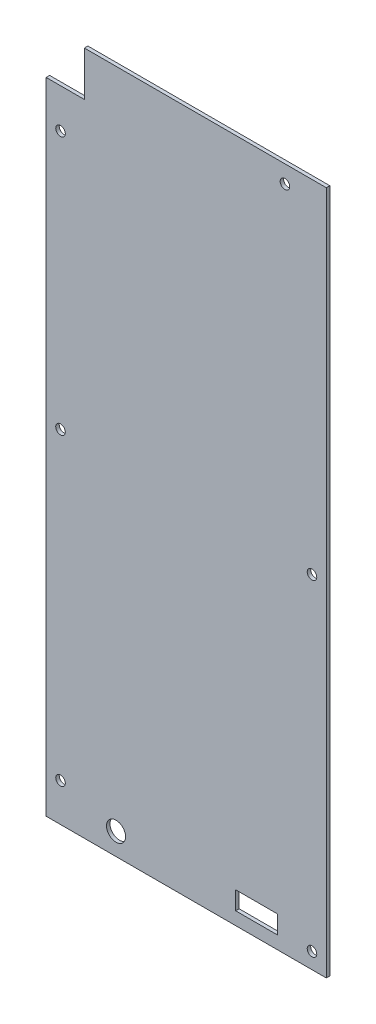
ISO-10303-21;
HEADER;
FILE_DESCRIPTION(('STEP AP214'),'2;1');
FILE_NAME('part.step','',(''),(''),'','','');
FILE_SCHEMA(('AUTOMOTIVE_DESIGN { 1 0 10303 214 1 1 1 1 }'));
ENDSEC;
DATA;
#1=APPLICATION_CONTEXT('core data for automotive mechanical design processes');
#2=APPLICATION_PROTOCOL_DEFINITION('international standard','automotive_design',2000,#1);
#3=PRODUCT_CONTEXT('',#1,'mechanical');
#4=PRODUCT('Part','Part','',(#3));
#5=PRODUCT_RELATED_PRODUCT_CATEGORY('part','',(#4));
#6=PRODUCT_DEFINITION_FORMATION('','',#4);
#7=PRODUCT_DEFINITION_CONTEXT('part definition',#1,'design');
#8=PRODUCT_DEFINITION('design','',#6,#7);
#9=PRODUCT_DEFINITION_SHAPE('','',#8);
#10=(LENGTH_UNIT() NAMED_UNIT(*) SI_UNIT(.MILLI.,.METRE.));
#11=(NAMED_UNIT(*) PLANE_ANGLE_UNIT() SI_UNIT($,.RADIAN.));
#12=(NAMED_UNIT(*) SI_UNIT($,.STERADIAN.) SOLID_ANGLE_UNIT());
#13=UNCERTAINTY_MEASURE_WITH_UNIT(LENGTH_MEASURE(1.E-05),#10,'distance_accuracy_value','');
#14=(GEOMETRIC_REPRESENTATION_CONTEXT(3) GLOBAL_UNCERTAINTY_ASSIGNED_CONTEXT((#13)) GLOBAL_UNIT_ASSIGNED_CONTEXT((#10,
#11,#12)) REPRESENTATION_CONTEXT('',''));
#15=CARTESIAN_POINT('',(0.,0.,0.));
#16=DIRECTION('',(0.,0.,1.));
#17=DIRECTION('',(1.,0.,0.));
#18=AXIS2_PLACEMENT_3D('',#15,#16,#17);
#19=CARTESIAN_POINT('',(-43.4054880311596,36.5751828079822,1.1));
#20=DIRECTION('',(1.,0.,0.));
#21=DIRECTION('',(0.,0.,-1.));
#22=AXIS2_PLACEMENT_3D('',#19,#20,#21);
#23=PLANE('',#22);
#24=DIRECTION('',(0.,-1.,0.));
#25=VECTOR('',#24,1.);
#26=CARTESIAN_POINT('',(-43.4054880311596,36.5751828079822,1.1));
#27=LINE('',#26,#25);
#28=CARTESIAN_POINT('',(-43.4054880311596,22.5761319376729,1.1));
#29=VERTEX_POINT('',#28);
#30=CARTESIAN_POINT('',(-43.4054880311596,-178.424817192018,1.1));
#31=VERTEX_POINT('',#30);
#32=EDGE_CURVE('E222',#29,#31,#27,.T.);
#33=ORIENTED_EDGE('',*,*,#32,.F.);
#34=DIRECTION('',(0.,0.,1.));
#35=VECTOR('',#34,1.);
#36=CARTESIAN_POINT('',(-43.4054880311596,22.5761319376729,0.));
#37=LINE('',#36,#35);
#38=CARTESIAN_POINT('',(-43.4054880311596,22.5761319376729,0.));
#39=VERTEX_POINT('',#38);
#40=EDGE_CURVE('E176',#39,#29,#37,.T.);
#41=ORIENTED_EDGE('',*,*,#40,.F.);
#42=DIRECTION('',(0.,-1.,0.));
#43=VECTOR('',#42,1.);
#44=CARTESIAN_POINT('',(-43.4054880311596,36.5751828079822,0.));
#45=LINE('',#44,#43);
#46=CARTESIAN_POINT('',(-43.4054880311596,-178.424817192018,0.));
#47=VERTEX_POINT('',#46);
#48=EDGE_CURVE('E221',#39,#47,#45,.T.);
#49=ORIENTED_EDGE('',*,*,#48,.T.);
#50=DIRECTION('',(0.,0.,-1.));
#51=VECTOR('',#50,1.);
#52=CARTESIAN_POINT('',(-43.4054880311596,-178.424817192018,1.1));
#53=LINE('',#52,#51);
#54=EDGE_CURVE('E12',#31,#47,#53,.T.);
#55=ORIENTED_EDGE('',*,*,#54,.F.);
#56=EDGE_LOOP('',(#33,#41,#49,#55));
#57=FACE_BOUND('',#56,.T.);
#58=ADVANCED_FACE('F40',(#57),#23,.F.);
#59=CARTESIAN_POINT('',(-43.4054880311596,-178.424817192018,1.1));
#60=DIRECTION('',(0.,1.,0.));
#61=DIRECTION('',(-1.,0.,0.));
#62=AXIS2_PLACEMENT_3D('',#59,#60,#61);
#63=PLANE('',#62);
#64=DIRECTION('',(1.,0.,0.));
#65=VECTOR('',#64,1.);
#66=CARTESIAN_POINT('',(-43.4054880311596,-178.424817192018,0.));
#67=LINE('',#66,#65);
#68=CARTESIAN_POINT('',(44.5945119688404,-178.424817192018,0.));
#69=VERTEX_POINT('',#68);
#70=EDGE_CURVE('E235',#47,#69,#67,.T.);
#71=ORIENTED_EDGE('',*,*,#70,.T.);
#72=DIRECTION('',(0.,0.,-1.));
#73=VECTOR('',#72,1.);
#74=CARTESIAN_POINT('',(44.5945119688404,-178.424817192018,1.1));
#75=LINE('',#74,#73);
#76=CARTESIAN_POINT('',(44.5945119688404,-178.424817192018,1.1));
#77=VERTEX_POINT('',#76);
#78=EDGE_CURVE('E48',#77,#69,#75,.T.);
#79=ORIENTED_EDGE('',*,*,#78,.F.);
#80=DIRECTION('',(1.,0.,0.));
#81=VECTOR('',#80,1.);
#82=CARTESIAN_POINT('',(-43.4054880311596,-178.424817192018,1.1));
#83=LINE('',#82,#81);
#84=EDGE_CURVE('E224',#31,#77,#83,.T.);
#85=ORIENTED_EDGE('',*,*,#84,.F.);
#86=ORIENTED_EDGE('',*,*,#54,.T.);
#87=EDGE_LOOP('',(#71,#79,#85,#86));
#88=FACE_BOUND('',#87,.T.);
#89=ADVANCED_FACE('F258',(#88),#63,.F.);
#90=CARTESIAN_POINT('',(44.5945119688404,36.5751828079822,1.1));
#91=DIRECTION('',(-1.,0.,0.));
#92=DIRECTION('',(0.,0.,1.));
#93=AXIS2_PLACEMENT_3D('',#90,#91,#92);
#94=PLANE('',#93);
#95=DIRECTION('',(0.,1.,0.));
#96=VECTOR('',#95,1.);
#97=CARTESIAN_POINT('',(44.5945119688404,36.5751828079822,0.));
#98=LINE('',#97,#96);
#99=CARTESIAN_POINT('',(44.5945119688404,36.5751828079822,0.));
#100=VERTEX_POINT('',#99);
#101=EDGE_CURVE('E241',#69,#100,#98,.T.);
#102=ORIENTED_EDGE('',*,*,#101,.T.);
#103=DIRECTION('',(0.,0.,-1.));
#104=VECTOR('',#103,1.);
#105=CARTESIAN_POINT('',(44.5945119688404,36.5751828079822,1.1));
#106=LINE('',#105,#104);
#107=CARTESIAN_POINT('',(44.5945119688404,36.5751828079822,1.1));
#108=VERTEX_POINT('',#107);
#109=EDGE_CURVE('E232',#108,#100,#106,.T.);
#110=ORIENTED_EDGE('',*,*,#109,.F.);
#111=DIRECTION('',(0.,1.,0.));
#112=VECTOR('',#111,1.);
#113=CARTESIAN_POINT('',(44.5945119688404,36.5751828079822,1.1));
#114=LINE('',#113,#112);
#115=EDGE_CURVE('E227',#77,#108,#114,.T.);
#116=ORIENTED_EDGE('',*,*,#115,.F.);
#117=ORIENTED_EDGE('',*,*,#78,.T.);
#118=EDGE_LOOP('',(#102,#110,#116,#117));
#119=FACE_BOUND('',#118,.T.);
#120=ADVANCED_FACE('F250',(#119),#94,.F.);
#121=CARTESIAN_POINT('',(-43.4054880311596,36.5751828079822,1.1));
#122=DIRECTION('',(0.,-1.,0.));
#123=DIRECTION('',(0.,0.,-1.));
#124=AXIS2_PLACEMENT_3D('',#121,#122,#123);
#125=PLANE('',#124);
#126=DIRECTION('',(-1.,0.,0.));
#127=VECTOR('',#126,1.);
#128=CARTESIAN_POINT('',(-43.4054880311596,36.5751828079822,0.));
#129=LINE('',#128,#127);
#130=CARTESIAN_POINT('',(-31.4054880311596,36.5751828079822,0.));
#131=VERTEX_POINT('',#130);
#132=EDGE_CURVE('E225',#100,#131,#129,.T.);
#133=ORIENTED_EDGE('',*,*,#132,.T.);
#134=DIRECTION('',(0.,0.,1.));
#135=VECTOR('',#134,1.);
#136=CARTESIAN_POINT('',(-31.4054880311596,36.5751828079822,0.));
#137=LINE('',#136,#135);
#138=CARTESIAN_POINT('',(-31.4054880311596,36.5751828079822,1.1));
#139=VERTEX_POINT('',#138);
#140=EDGE_CURVE('E171',#131,#139,#137,.T.);
#141=ORIENTED_EDGE('',*,*,#140,.T.);
#142=DIRECTION('',(-1.,0.,0.));
#143=VECTOR('',#142,1.);
#144=CARTESIAN_POINT('',(-43.4054880311596,36.5751828079822,1.1));
#145=LINE('',#144,#143);
#146=EDGE_CURVE('E229',#108,#139,#145,.T.);
#147=ORIENTED_EDGE('',*,*,#146,.F.);
#148=ORIENTED_EDGE('',*,*,#109,.T.);
#149=EDGE_LOOP('',(#133,#141,#147,#148));
#150=FACE_BOUND('',#149,.T.);
#151=ADVANCED_FACE('F272',(#150),#125,.F.);
#152=CARTESIAN_POINT('',(0.,0.,1.1));
#153=DIRECTION('',(0.,0.,1.));
#154=DIRECTION('',(1.,0.,0.));
#155=AXIS2_PLACEMENT_3D('',#152,#153,#154);
#156=PLANE('',#155);
#157=DIRECTION('',(0.,-1.,0.));
#158=VECTOR('',#157,1.);
#159=CARTESIAN_POINT('',(16.1045119688404,-168.664817192018,1.1));
#160=LINE('',#159,#158);
#161=CARTESIAN_POINT('',(16.1045119688404,-168.664817192018,1.1));
#162=VERTEX_POINT('',#161);
#163=CARTESIAN_POINT('',(16.1045119688404,-174.384817192018,1.1));
#164=VERTEX_POINT('',#163);
#165=EDGE_CURVE('E56',#162,#164,#160,.T.);
#166=ORIENTED_EDGE('',*,*,#165,.F.);
#167=DIRECTION('',(-1.,0.,0.));
#168=VECTOR('',#167,1.);
#169=CARTESIAN_POINT('',(16.1045119688404,-168.664817192018,1.1));
#170=LINE('',#169,#168);
#171=CARTESIAN_POINT('',(29.2045119688404,-168.664817192018,1.1));
#172=VERTEX_POINT('',#171);
#173=EDGE_CURVE('E136',#172,#162,#170,.T.);
#174=ORIENTED_EDGE('',*,*,#173,.F.);
#175=DIRECTION('',(0.,1.,0.));
#176=VECTOR('',#175,1.);
#177=CARTESIAN_POINT('',(29.2045119688404,-168.664817192018,1.1));
#178=LINE('',#177,#176);
#179=CARTESIAN_POINT('',(29.2045119688404,-174.384817192018,1.1));
#180=VERTEX_POINT('',#179);
#181=EDGE_CURVE('E139',#180,#172,#178,.T.);
#182=ORIENTED_EDGE('',*,*,#181,.F.);
#183=DIRECTION('',(1.,0.,0.));
#184=VECTOR('',#183,1.);
#185=CARTESIAN_POINT('',(16.1045119688404,-174.384817192018,1.1));
#186=LINE('',#185,#184);
#187=EDGE_CURVE('E145',#164,#180,#186,.T.);
#188=ORIENTED_EDGE('',*,*,#187,.F.);
#189=EDGE_LOOP('',(#166,#174,#182,#188));
#190=FACE_BOUND('',#189,.T.);
#191=CARTESIAN_POINT('',(-21.46548803116,-171.524817192018,1.1));
#192=DIRECTION('',(0.,0.,1.));
#193=DIRECTION('',(1.,0.,0.));
#194=AXIS2_PLACEMENT_3D('',#191,#192,#193);
#195=CIRCLE('',#194,3.);
#196=CARTESIAN_POINT('',(-18.46548803116,-171.524817192018,1.1));
#197=VERTEX_POINT('',#196);
#198=EDGE_CURVE('E151',#197,#197,#195,.T.);
#199=ORIENTED_EDGE('',*,*,#198,.F.);
#200=EDGE_LOOP('',(#199));
#201=FACE_BOUND('',#200,.T.);
#202=CARTESIAN_POINT('',(40.0945119688406,-173.424817192018,1.1));
#203=DIRECTION('',(0.,0.,1.));
#204=DIRECTION('',(1.,0.,0.));
#205=AXIS2_PLACEMENT_3D('',#202,#203,#204);
#206=CIRCLE('',#205,1.5);
#207=CARTESIAN_POINT('',(41.5945119688406,-173.424817192018,1.1));
#208=VERTEX_POINT('',#207);
#209=EDGE_CURVE('E218',#208,#208,#206,.T.);
#210=ORIENTED_EDGE('',*,*,#209,.F.);
#211=EDGE_LOOP('',(#210));
#212=FACE_BOUND('',#211,.T.);
#213=CARTESIAN_POINT('',(40.0945119688404,-70.9248171920178,1.1));
#214=DIRECTION('',(0.,0.,1.));
#215=DIRECTION('',(1.,0.,0.));
#216=AXIS2_PLACEMENT_3D('',#213,#214,#215);
#217=CIRCLE('',#216,1.5);
#218=CARTESIAN_POINT('',(41.5945119688404,-70.9248171920178,1.1));
#219=VERTEX_POINT('',#218);
#220=EDGE_CURVE('E215',#219,#219,#217,.T.);
#221=ORIENTED_EDGE('',*,*,#220,.F.);
#222=EDGE_LOOP('',(#221));
#223=FACE_BOUND('',#222,.T.);
#224=CARTESIAN_POINT('',(-38.9054880311596,10.2551828079822,1.1));
#225=DIRECTION('',(0.,0.,1.));
#226=DIRECTION('',(1.,0.,0.));
#227=AXIS2_PLACEMENT_3D('',#224,#225,#226);
#228=CIRCLE('',#227,1.50000000000198);
#229=CARTESIAN_POINT('',(-37.4054880311576,10.2551828079822,1.1));
#230=VERTEX_POINT('',#229);
#231=EDGE_CURVE('E212',#230,#230,#228,.T.);
#232=ORIENTED_EDGE('',*,*,#231,.F.);
#233=EDGE_LOOP('',(#232));
#234=FACE_BOUND('',#233,.T.);
#235=CARTESIAN_POINT('',(-38.9054880311596,-70.9248171920178,1.1));
#236=DIRECTION('',(0.,0.,1.));
#237=DIRECTION('',(1.,0.,0.));
#238=AXIS2_PLACEMENT_3D('',#235,#236,#237);
#239=CIRCLE('',#238,1.5);
#240=CARTESIAN_POINT('',(-37.4054880311596,-70.9248171920178,1.1));
#241=VERTEX_POINT('',#240);
#242=EDGE_CURVE('E209',#241,#241,#239,.T.);
#243=ORIENTED_EDGE('',*,*,#242,.F.);
#244=EDGE_LOOP('',(#243));
#245=FACE_BOUND('',#244,.T.);
#246=CARTESIAN_POINT('',(-38.9054880311596,-166.424817192018,1.1));
#247=DIRECTION('',(0.,0.,1.));
#248=DIRECTION('',(1.,0.,0.));
#249=AXIS2_PLACEMENT_3D('',#246,#247,#248);
#250=CIRCLE('',#249,1.5);
#251=CARTESIAN_POINT('',(-37.4054880311596,-166.424817192018,1.1));
#252=VERTEX_POINT('',#251);
#253=EDGE_CURVE('E206',#252,#252,#250,.T.);
#254=ORIENTED_EDGE('',*,*,#253,.F.);
#255=EDGE_LOOP('',(#254));
#256=FACE_BOUND('',#255,.T.);
#257=CARTESIAN_POINT('',(31.5945119688404,31.0751828079823,1.1));
#258=DIRECTION('',(0.,0.,1.));
#259=DIRECTION('',(1.,0.,0.));
#260=AXIS2_PLACEMENT_3D('',#257,#258,#259);
#261=CIRCLE('',#260,1.50000000000098);
#262=CARTESIAN_POINT('',(33.0945119688414,31.0751828079823,1.1));
#263=VERTEX_POINT('',#262);
#264=EDGE_CURVE('E203',#263,#263,#261,.T.);
#265=ORIENTED_EDGE('',*,*,#264,.F.);
#266=EDGE_LOOP('',(#265));
#267=FACE_BOUND('',#266,.T.);
#268=DIRECTION('',(0.,1.,0.));
#269=VECTOR('',#268,1.);
#270=CARTESIAN_POINT('',(-31.4054880311596,0.,1.1));
#271=LINE('',#270,#269);
#272=CARTESIAN_POINT('',(-31.4054880311596,22.5761319376729,1.1));
#273=VERTEX_POINT('',#272);
#274=EDGE_CURVE('E201',#273,#139,#271,.T.);
#275=ORIENTED_EDGE('',*,*,#274,.F.);
#276=DIRECTION('',(1.,0.,0.));
#277=VECTOR('',#276,1.);
#278=CARTESIAN_POINT('',(0.,22.5761319376729,1.1));
#279=LINE('',#278,#277);
#280=EDGE_CURVE('E184',#29,#273,#279,.T.);
#281=ORIENTED_EDGE('',*,*,#280,.F.);
#282=ORIENTED_EDGE('',*,*,#32,.T.);
#283=ORIENTED_EDGE('',*,*,#84,.T.);
#284=ORIENTED_EDGE('',*,*,#115,.T.);
#285=ORIENTED_EDGE('',*,*,#146,.T.);
#286=EDGE_LOOP('',(#275,#281,#282,#283,#284,#285));
#287=FACE_BOUND('',#286,.T.);
#288=ADVANCED_FACE('F274',(#190,#201,#212,#223,#234,#245,#256,#267,#287),#156,.T.);
#289=CARTESIAN_POINT('',(0.,0.,0.));
#290=DIRECTION('',(0.,0.,1.));
#291=DIRECTION('',(1.,0.,0.));
#292=AXIS2_PLACEMENT_3D('',#289,#290,#291);
#293=PLANE('',#292);
#294=DIRECTION('',(-1.,0.,0.));
#295=VECTOR('',#294,1.);
#296=CARTESIAN_POINT('',(16.1045119688404,-168.664817192018,0.));
#297=LINE('',#296,#295);
#298=CARTESIAN_POINT('',(29.2045119688404,-168.664817192018,0.));
#299=VERTEX_POINT('',#298);
#300=CARTESIAN_POINT('',(16.1045119688404,-168.664817192018,0.));
#301=VERTEX_POINT('',#300);
#302=EDGE_CURVE('E126',#299,#301,#297,.T.);
#303=ORIENTED_EDGE('',*,*,#302,.T.);
#304=DIRECTION('',(0.,-1.,0.));
#305=VECTOR('',#304,1.);
#306=CARTESIAN_POINT('',(16.1045119688404,-168.664817192018,0.));
#307=LINE('',#306,#305);
#308=CARTESIAN_POINT('',(16.1045119688404,-174.384817192018,0.));
#309=VERTEX_POINT('',#308);
#310=EDGE_CURVE('E120',#301,#309,#307,.T.);
#311=ORIENTED_EDGE('',*,*,#310,.T.);
#312=DIRECTION('',(1.,0.,0.));
#313=VECTOR('',#312,1.);
#314=CARTESIAN_POINT('',(16.1045119688404,-174.384817192018,0.));
#315=LINE('',#314,#313);
#316=CARTESIAN_POINT('',(29.2045119688404,-174.384817192018,0.));
#317=VERTEX_POINT('',#316);
#318=EDGE_CURVE('E129',#309,#317,#315,.T.);
#319=ORIENTED_EDGE('',*,*,#318,.T.);
#320=DIRECTION('',(0.,1.,0.));
#321=VECTOR('',#320,1.);
#322=CARTESIAN_POINT('',(29.2045119688404,-168.664817192018,0.));
#323=LINE('',#322,#321);
#324=EDGE_CURVE('E64',#317,#299,#323,.T.);
#325=ORIENTED_EDGE('',*,*,#324,.T.);
#326=EDGE_LOOP('',(#303,#311,#319,#325));
#327=FACE_BOUND('',#326,.T.);
#328=CARTESIAN_POINT('',(-21.46548803116,-171.524817192018,0.));
#329=DIRECTION('',(0.,0.,1.));
#330=DIRECTION('',(1.,0.,0.));
#331=AXIS2_PLACEMENT_3D('',#328,#329,#330);
#332=CIRCLE('',#331,3.);
#333=CARTESIAN_POINT('',(-18.46548803116,-171.524817192018,0.));
#334=VERTEX_POINT('',#333);
#335=EDGE_CURVE('E155',#334,#334,#332,.T.);
#336=ORIENTED_EDGE('',*,*,#335,.T.);
#337=EDGE_LOOP('',(#336));
#338=FACE_BOUND('',#337,.T.);
#339=CARTESIAN_POINT('',(40.0945119688406,-173.424817192018,0.));
#340=DIRECTION('',(0.,0.,1.));
#341=DIRECTION('',(1.,0.,0.));
#342=AXIS2_PLACEMENT_3D('',#339,#340,#341);
#343=CIRCLE('',#342,1.5);
#344=CARTESIAN_POINT('',(41.5945119688406,-173.424817192018,0.));
#345=VERTEX_POINT('',#344);
#346=EDGE_CURVE('E43',#345,#345,#343,.T.);
#347=ORIENTED_EDGE('',*,*,#346,.T.);
#348=EDGE_LOOP('',(#347));
#349=FACE_BOUND('',#348,.T.);
#350=CARTESIAN_POINT('',(40.0945119688404,-70.9248171920178,0.));
#351=DIRECTION('',(0.,0.,1.));
#352=DIRECTION('',(1.,0.,0.));
#353=AXIS2_PLACEMENT_3D('',#350,#351,#352);
#354=CIRCLE('',#353,1.5);
#355=CARTESIAN_POINT('',(41.5945119688404,-70.9248171920178,0.));
#356=VERTEX_POINT('',#355);
#357=EDGE_CURVE('E158',#356,#356,#354,.T.);
#358=ORIENTED_EDGE('',*,*,#357,.T.);
#359=EDGE_LOOP('',(#358));
#360=FACE_BOUND('',#359,.T.);
#361=CARTESIAN_POINT('',(-38.9054880311596,10.2551828079822,0.));
#362=DIRECTION('',(0.,0.,1.));
#363=DIRECTION('',(1.,0.,0.));
#364=AXIS2_PLACEMENT_3D('',#361,#362,#363);
#365=CIRCLE('',#364,1.50000000000198);
#366=CARTESIAN_POINT('',(-37.4054880311576,10.2551828079822,0.));
#367=VERTEX_POINT('',#366);
#368=EDGE_CURVE('E168',#367,#367,#365,.T.);
#369=ORIENTED_EDGE('',*,*,#368,.T.);
#370=EDGE_LOOP('',(#369));
#371=FACE_BOUND('',#370,.T.);
#372=CARTESIAN_POINT('',(-38.9054880311596,-70.9248171920178,0.));
#373=DIRECTION('',(0.,0.,1.));
#374=DIRECTION('',(1.,0.,0.));
#375=AXIS2_PLACEMENT_3D('',#372,#373,#374);
#376=CIRCLE('',#375,1.5);
#377=CARTESIAN_POINT('',(-37.4054880311596,-70.9248171920178,0.));
#378=VERTEX_POINT('',#377);
#379=EDGE_CURVE('E164',#378,#378,#376,.T.);
#380=ORIENTED_EDGE('',*,*,#379,.T.);
#381=EDGE_LOOP('',(#380));
#382=FACE_BOUND('',#381,.T.);
#383=CARTESIAN_POINT('',(-38.9054880311596,-166.424817192018,0.));
#384=DIRECTION('',(0.,0.,1.));
#385=DIRECTION('',(1.,0.,0.));
#386=AXIS2_PLACEMENT_3D('',#383,#384,#385);
#387=CIRCLE('',#386,1.5);
#388=CARTESIAN_POINT('',(-37.4054880311596,-166.424817192018,0.));
#389=VERTEX_POINT('',#388);
#390=EDGE_CURVE('E161',#389,#389,#387,.T.);
#391=ORIENTED_EDGE('',*,*,#390,.T.);
#392=EDGE_LOOP('',(#391));
#393=FACE_BOUND('',#392,.T.);
#394=CARTESIAN_POINT('',(31.5945119688404,31.0751828079823,-4.3298697960376E-13));
#395=DIRECTION('',(0.,0.,1.));
#396=DIRECTION('',(1.,0.,0.));
#397=AXIS2_PLACEMENT_3D('',#394,#395,#396);
#398=CIRCLE('',#397,1.50000000000098);
#399=CARTESIAN_POINT('',(33.0945119688414,31.0751828079823,-4.3298697960376E-13));
#400=VERTEX_POINT('',#399);
#401=EDGE_CURVE('E165',#400,#400,#398,.T.);
#402=ORIENTED_EDGE('',*,*,#401,.T.);
#403=EDGE_LOOP('',(#402));
#404=FACE_BOUND('',#403,.T.);
#405=DIRECTION('',(1.,0.,0.));
#406=VECTOR('',#405,1.);
#407=CARTESIAN_POINT('',(-43.4054880311596,22.5761319376729,0.));
#408=LINE('',#407,#406);
#409=CARTESIAN_POINT('',(-31.4054880311596,22.5761319376729,0.));
#410=VERTEX_POINT('',#409);
#411=EDGE_CURVE('E178',#39,#410,#408,.T.);
#412=ORIENTED_EDGE('',*,*,#411,.T.);
#413=DIRECTION('',(0.,1.,0.));
#414=VECTOR('',#413,1.);
#415=CARTESIAN_POINT('',(-31.4054880311596,36.5751828079822,0.));
#416=LINE('',#415,#414);
#417=EDGE_CURVE('E179',#410,#131,#416,.T.);
#418=ORIENTED_EDGE('',*,*,#417,.T.);
#419=ORIENTED_EDGE('',*,*,#132,.F.);
#420=ORIENTED_EDGE('',*,*,#101,.F.);
#421=ORIENTED_EDGE('',*,*,#70,.F.);
#422=ORIENTED_EDGE('',*,*,#48,.F.);
#423=EDGE_LOOP('',(#412,#418,#419,#420,#421,#422));
#424=FACE_BOUND('',#423,.T.);
#425=ADVANCED_FACE('F133',(#327,#338,#349,#360,#371,#382,#393,#404,#424),#293,.F.);
#426=CARTESIAN_POINT('',(-31.4054880311596,36.5751828079822,0.));
#427=DIRECTION('',(1.,0.,0.));
#428=DIRECTION('',(0.,0.,-1.));
#429=AXIS2_PLACEMENT_3D('',#426,#427,#428);
#430=PLANE('',#429);
#431=ORIENTED_EDGE('',*,*,#274,.T.);
#432=ORIENTED_EDGE('',*,*,#140,.F.);
#433=ORIENTED_EDGE('',*,*,#417,.F.);
#434=DIRECTION('',(0.,0.,1.));
#435=VECTOR('',#434,1.);
#436=CARTESIAN_POINT('',(-31.4054880311596,22.5761319376729,0.));
#437=LINE('',#436,#435);
#438=EDGE_CURVE('E187',#410,#273,#437,.T.);
#439=ORIENTED_EDGE('',*,*,#438,.T.);
#440=EDGE_LOOP('',(#431,#432,#433,#439));
#441=FACE_BOUND('',#440,.T.);
#442=ADVANCED_FACE('F269',(#441),#430,.F.);
#443=CARTESIAN_POINT('',(-43.4054880311596,22.5761319376729,0.));
#444=DIRECTION('',(0.,-1.,0.));
#445=DIRECTION('',(1.,0.,0.));
#446=AXIS2_PLACEMENT_3D('',#443,#444,#445);
#447=PLANE('',#446);
#448=ORIENTED_EDGE('',*,*,#280,.T.);
#449=ORIENTED_EDGE('',*,*,#438,.F.);
#450=ORIENTED_EDGE('',*,*,#411,.F.);
#451=ORIENTED_EDGE('',*,*,#40,.T.);
#452=EDGE_LOOP('',(#448,#449,#450,#451));
#453=FACE_BOUND('',#452,.T.);
#454=ADVANCED_FACE('F265',(#453),#447,.F.);
#455=CARTESIAN_POINT('',(31.5945119688404,31.0751828079823,-4.3298697960376E-13));
#456=DIRECTION('',(0.,0.,1.));
#457=DIRECTION('',(1.,0.,0.));
#458=AXIS2_PLACEMENT_3D('',#455,#456,#457);
#459=CYLINDRICAL_SURFACE('',#458,1.50000000000098);
#460=ORIENTED_EDGE('',*,*,#264,.T.);
#461=EDGE_LOOP('',(#460));
#462=FACE_BOUND('',#461,.T.);
#463=ORIENTED_EDGE('',*,*,#401,.F.);
#464=EDGE_LOOP('',(#463));
#465=FACE_BOUND('',#464,.T.);
#466=ADVANCED_FACE('F313',(#462,#465),#459,.F.);
#467=CARTESIAN_POINT('',(-38.9054880311596,-166.424817192018,0.));
#468=DIRECTION('',(0.,0.,1.));
#469=DIRECTION('',(1.,0.,0.));
#470=AXIS2_PLACEMENT_3D('',#467,#468,#469);
#471=CYLINDRICAL_SURFACE('',#470,1.5);
#472=ORIENTED_EDGE('',*,*,#253,.T.);
#473=EDGE_LOOP('',(#472));
#474=FACE_BOUND('',#473,.T.);
#475=ORIENTED_EDGE('',*,*,#390,.F.);
#476=EDGE_LOOP('',(#475));
#477=FACE_BOUND('',#476,.T.);
#478=ADVANCED_FACE('F329',(#474,#477),#471,.F.);
#479=CARTESIAN_POINT('',(-38.9054880311596,-70.9248171920178,0.));
#480=DIRECTION('',(0.,0.,1.));
#481=DIRECTION('',(1.,0.,0.));
#482=AXIS2_PLACEMENT_3D('',#479,#480,#481);
#483=CYLINDRICAL_SURFACE('',#482,1.5);
#484=ORIENTED_EDGE('',*,*,#242,.T.);
#485=EDGE_LOOP('',(#484));
#486=FACE_BOUND('',#485,.T.);
#487=ORIENTED_EDGE('',*,*,#379,.F.);
#488=EDGE_LOOP('',(#487));
#489=FACE_BOUND('',#488,.T.);
#490=ADVANCED_FACE('F339',(#486,#489),#483,.F.);
#491=CARTESIAN_POINT('',(-38.9054880311596,10.2551828079822,0.));
#492=DIRECTION('',(0.,0.,1.));
#493=DIRECTION('',(1.,0.,0.));
#494=AXIS2_PLACEMENT_3D('',#491,#492,#493);
#495=CYLINDRICAL_SURFACE('',#494,1.50000000000198);
#496=ORIENTED_EDGE('',*,*,#231,.T.);
#497=EDGE_LOOP('',(#496));
#498=FACE_BOUND('',#497,.T.);
#499=ORIENTED_EDGE('',*,*,#368,.F.);
#500=EDGE_LOOP('',(#499));
#501=FACE_BOUND('',#500,.T.);
#502=ADVANCED_FACE('F349',(#498,#501),#495,.F.);
#503=CARTESIAN_POINT('',(40.0945119688404,-70.9248171920178,0.));
#504=DIRECTION('',(0.,0.,1.));
#505=DIRECTION('',(1.,0.,0.));
#506=AXIS2_PLACEMENT_3D('',#503,#504,#505);
#507=CYLINDRICAL_SURFACE('',#506,1.5);
#508=ORIENTED_EDGE('',*,*,#220,.T.);
#509=EDGE_LOOP('',(#508));
#510=FACE_BOUND('',#509,.T.);
#511=ORIENTED_EDGE('',*,*,#357,.F.);
#512=EDGE_LOOP('',(#511));
#513=FACE_BOUND('',#512,.T.);
#514=ADVANCED_FACE('F359',(#510,#513),#507,.F.);
#515=CARTESIAN_POINT('',(40.0945119688406,-173.424817192018,-0.0400520185751729));
#516=DIRECTION('',(0.,0.,1.));
#517=DIRECTION('',(1.,0.,0.));
#518=AXIS2_PLACEMENT_3D('',#515,#516,#517);
#519=CYLINDRICAL_SURFACE('',#518,1.5);
#520=ORIENTED_EDGE('',*,*,#209,.T.);
#521=EDGE_LOOP('',(#520));
#522=FACE_BOUND('',#521,.T.);
#523=ORIENTED_EDGE('',*,*,#346,.F.);
#524=EDGE_LOOP('',(#523));
#525=FACE_BOUND('',#524,.T.);
#526=ADVANCED_FACE('F369',(#522,#525),#519,.F.);
#527=CARTESIAN_POINT('',(-21.46548803116,-171.524817192018,0.));
#528=DIRECTION('',(0.,0.,1.));
#529=DIRECTION('',(1.,0.,0.));
#530=AXIS2_PLACEMENT_3D('',#527,#528,#529);
#531=CYLINDRICAL_SURFACE('',#530,3.);
#532=ORIENTED_EDGE('',*,*,#335,.F.);
#533=EDGE_LOOP('',(#532));
#534=FACE_BOUND('',#533,.T.);
#535=ORIENTED_EDGE('',*,*,#198,.T.);
#536=EDGE_LOOP('',(#535));
#537=FACE_BOUND('',#536,.T.);
#538=ADVANCED_FACE('F379',(#534,#537),#531,.F.);
#539=CARTESIAN_POINT('',(16.1045119688404,-168.664817192018,0.));
#540=DIRECTION('',(-1.,0.,0.));
#541=DIRECTION('',(0.,-1.,0.));
#542=AXIS2_PLACEMENT_3D('',#539,#540,#541);
#543=PLANE('',#542);
#544=ORIENTED_EDGE('',*,*,#165,.T.);
#545=DIRECTION('',(0.,0.,1.));
#546=VECTOR('',#545,1.);
#547=CARTESIAN_POINT('',(16.1045119688404,-174.384817192018,0.));
#548=LINE('',#547,#546);
#549=EDGE_CURVE('E116',#309,#164,#548,.T.);
#550=ORIENTED_EDGE('',*,*,#549,.F.);
#551=ORIENTED_EDGE('',*,*,#310,.F.);
#552=DIRECTION('',(0.,0.,1.));
#553=VECTOR('',#552,1.);
#554=CARTESIAN_POINT('',(16.1045119688404,-168.664817192018,0.));
#555=LINE('',#554,#553);
#556=EDGE_CURVE('E149',#301,#162,#555,.T.);
#557=ORIENTED_EDGE('',*,*,#556,.T.);
#558=EDGE_LOOP('',(#544,#550,#551,#557));
#559=FACE_BOUND('',#558,.T.);
#560=ADVANCED_FACE('F118',(#559),#543,.F.);
#561=CARTESIAN_POINT('',(16.1045119688404,-168.664817192018,0.));
#562=DIRECTION('',(0.,1.,0.));
#563=DIRECTION('',(0.,0.,1.));
#564=AXIS2_PLACEMENT_3D('',#561,#562,#563);
#565=PLANE('',#564);
#566=ORIENTED_EDGE('',*,*,#173,.T.);
#567=ORIENTED_EDGE('',*,*,#556,.F.);
#568=ORIENTED_EDGE('',*,*,#302,.F.);
#569=DIRECTION('',(0.,0.,1.));
#570=VECTOR('',#569,1.);
#571=CARTESIAN_POINT('',(29.2045119688404,-168.664817192018,0.));
#572=LINE('',#571,#570);
#573=EDGE_CURVE('E152',#299,#172,#572,.T.);
#574=ORIENTED_EDGE('',*,*,#573,.T.);
#575=EDGE_LOOP('',(#566,#567,#568,#574));
#576=FACE_BOUND('',#575,.T.);
#577=ADVANCED_FACE('F406',(#576),#565,.F.);
#578=CARTESIAN_POINT('',(29.2045119688404,-168.664817192018,0.));
#579=DIRECTION('',(1.,0.,0.));
#580=DIRECTION('',(0.,1.,0.));
#581=AXIS2_PLACEMENT_3D('',#578,#579,#580);
#582=PLANE('',#581);
#583=ORIENTED_EDGE('',*,*,#181,.T.);
#584=ORIENTED_EDGE('',*,*,#573,.F.);
#585=ORIENTED_EDGE('',*,*,#324,.F.);
#586=DIRECTION('',(0.,0.,1.));
#587=VECTOR('',#586,1.);
#588=CARTESIAN_POINT('',(29.2045119688404,-174.384817192018,0.));
#589=LINE('',#588,#587);
#590=EDGE_CURVE('E125',#317,#180,#589,.T.);
#591=ORIENTED_EDGE('',*,*,#590,.T.);
#592=EDGE_LOOP('',(#583,#584,#585,#591));
#593=FACE_BOUND('',#592,.T.);
#594=ADVANCED_FACE('F415',(#593),#582,.F.);
#595=CARTESIAN_POINT('',(16.1045119688404,-174.384817192018,0.));
#596=DIRECTION('',(0.,-1.,0.));
#597=DIRECTION('',(0.,0.,-1.));
#598=AXIS2_PLACEMENT_3D('',#595,#596,#597);
#599=PLANE('',#598);
#600=ORIENTED_EDGE('',*,*,#187,.T.);
#601=ORIENTED_EDGE('',*,*,#590,.F.);
#602=ORIENTED_EDGE('',*,*,#318,.F.);
#603=ORIENTED_EDGE('',*,*,#549,.T.);
#604=EDGE_LOOP('',(#600,#601,#602,#603));
#605=FACE_BOUND('',#604,.T.);
#606=ADVANCED_FACE('F130',(#605),#599,.F.);
#607=CLOSED_SHELL('',(#58,#89,#120,#151,#288,#425,#442,#454,#466,#478,#490,#502,#514,#526,#538,
#560,#577,#594,#606));
#608=MANIFOLD_SOLID_BREP('B2',#607);
#609=ADVANCED_BREP_SHAPE_REPRESENTATION('',(#18,#608),#14);
#610=SHAPE_DEFINITION_REPRESENTATION(#9,#609);
ENDSEC;
END-ISO-10303-21;
